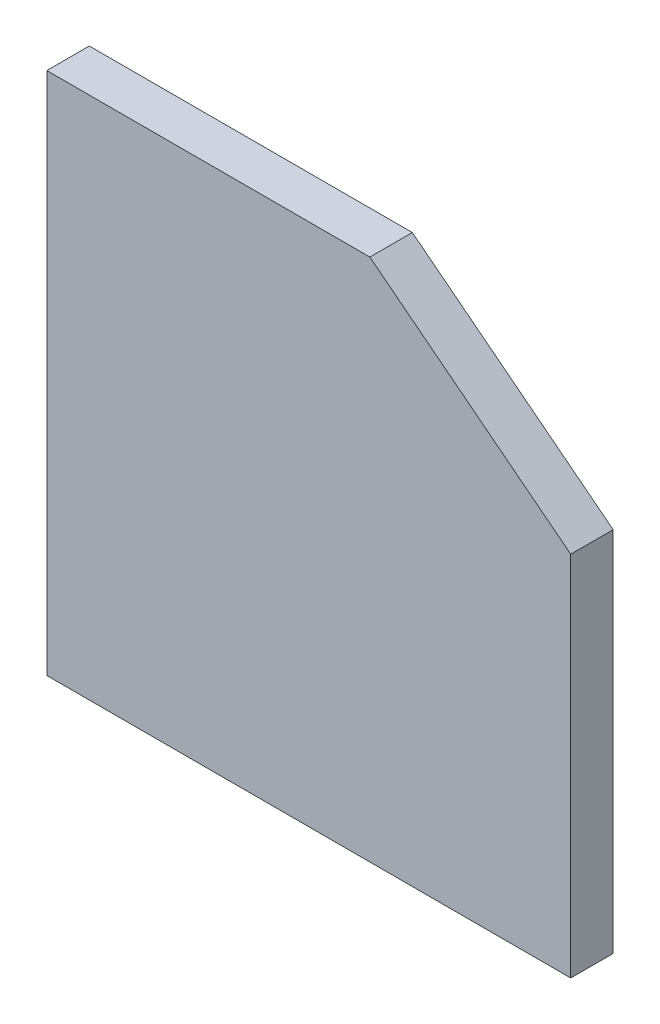
ISO-10303-21;
HEADER;
FILE_DESCRIPTION(('STEP AP214'),'2;1');
FILE_NAME('part.step','',(''),(''),'','','');
FILE_SCHEMA(('AUTOMOTIVE_DESIGN { 1 0 10303 214 1 1 1 1 }'));
ENDSEC;
DATA;
#1=APPLICATION_CONTEXT('core data for automotive mechanical design processes');
#2=APPLICATION_PROTOCOL_DEFINITION('international standard','automotive_design',2000,#1);
#3=PRODUCT_CONTEXT('',#1,'mechanical');
#4=PRODUCT('Part','Part','',(#3));
#5=PRODUCT_RELATED_PRODUCT_CATEGORY('part','',(#4));
#6=PRODUCT_DEFINITION_FORMATION('','',#4);
#7=PRODUCT_DEFINITION_CONTEXT('part definition',#1,'design');
#8=PRODUCT_DEFINITION('design','',#6,#7);
#9=PRODUCT_DEFINITION_SHAPE('','',#8);
#10=(LENGTH_UNIT() NAMED_UNIT(*) SI_UNIT(.MILLI.,.METRE.));
#11=(NAMED_UNIT(*) PLANE_ANGLE_UNIT() SI_UNIT($,.RADIAN.));
#12=(NAMED_UNIT(*) SI_UNIT($,.STERADIAN.) SOLID_ANGLE_UNIT());
#13=UNCERTAINTY_MEASURE_WITH_UNIT(LENGTH_MEASURE(1.E-05),#10,'distance_accuracy_value','');
#14=(GEOMETRIC_REPRESENTATION_CONTEXT(3) GLOBAL_UNCERTAINTY_ASSIGNED_CONTEXT((#13)) GLOBAL_UNIT_ASSIGNED_CONTEXT((#10,
#11,#12)) REPRESENTATION_CONTEXT('',''));
#15=CARTESIAN_POINT('',(0.,0.,0.));
#16=DIRECTION('',(0.,0.,1.));
#17=DIRECTION('',(1.,0.,0.));
#18=AXIS2_PLACEMENT_3D('',#15,#16,#17);
#19=CARTESIAN_POINT('',(0.,0.,3.));
#20=DIRECTION('',(0.,1.,0.));
#21=DIRECTION('',(0.,0.,1.));
#22=AXIS2_PLACEMENT_3D('',#19,#20,#21);
#23=PLANE('',#22);
#24=DIRECTION('',(1.,0.,0.));
#25=VECTOR('',#24,1.);
#26=CARTESIAN_POINT('',(0.,0.,0.));
#27=LINE('',#26,#25);
#28=CARTESIAN_POINT('',(0.,0.,0.));
#29=VERTEX_POINT('',#28);
#30=CARTESIAN_POINT('',(36.9999999999999,0.,0.));
#31=VERTEX_POINT('',#30);
#32=EDGE_CURVE('E113',#29,#31,#27,.T.);
#33=ORIENTED_EDGE('',*,*,#32,.T.);
#34=DIRECTION('',(0.,0.,-1.));
#35=VECTOR('',#34,1.);
#36=CARTESIAN_POINT('',(36.9999999999999,0.,3.));
#37=LINE('',#36,#35);
#38=CARTESIAN_POINT('',(36.9999999999999,0.,3.));
#39=VERTEX_POINT('',#38);
#40=EDGE_CURVE('E11',#39,#31,#37,.T.);
#41=ORIENTED_EDGE('',*,*,#40,.F.);
#42=DIRECTION('',(1.,0.,0.));
#43=VECTOR('',#42,1.);
#44=CARTESIAN_POINT('',(0.,0.,3.));
#45=LINE('',#44,#43);
#46=CARTESIAN_POINT('',(0.,0.,3.));
#47=VERTEX_POINT('',#46);
#48=EDGE_CURVE('E124',#47,#39,#45,.T.);
#49=ORIENTED_EDGE('',*,*,#48,.F.);
#50=DIRECTION('',(0.,0.,-1.));
#51=VECTOR('',#50,1.);
#52=CARTESIAN_POINT('',(0.,0.,3.));
#53=LINE('',#52,#51);
#54=EDGE_CURVE('E55',#47,#29,#53,.T.);
#55=ORIENTED_EDGE('',*,*,#54,.T.);
#56=EDGE_LOOP('',(#33,#41,#49,#55));
#57=FACE_BOUND('',#56,.T.);
#58=ADVANCED_FACE('F39',(#57),#23,.F.);
#59=CARTESIAN_POINT('',(36.9999999999999,0.,3.));
#60=DIRECTION('',(-1.,0.,0.));
#61=DIRECTION('',(0.,0.,1.));
#62=AXIS2_PLACEMENT_3D('',#59,#60,#61);
#63=PLANE('',#62);
#64=DIRECTION('',(0.,1.,0.));
#65=VECTOR('',#64,1.);
#66=CARTESIAN_POINT('',(36.9999999999999,0.,0.));
#67=LINE('',#66,#65);
#68=CARTESIAN_POINT('',(36.9999999999999,25.9180934441379,0.));
#69=VERTEX_POINT('',#68);
#70=EDGE_CURVE('E115',#31,#69,#67,.T.);
#71=ORIENTED_EDGE('',*,*,#70,.T.);
#72=DIRECTION('',(0.,0.,-1.));
#73=VECTOR('',#72,1.);
#74=CARTESIAN_POINT('',(36.9999999999999,25.9180934441379,3.));
#75=LINE('',#74,#73);
#76=CARTESIAN_POINT('',(36.9999999999999,25.9180934441379,3.));
#77=VERTEX_POINT('',#76);
#78=EDGE_CURVE('E47',#77,#69,#75,.T.);
#79=ORIENTED_EDGE('',*,*,#78,.F.);
#80=DIRECTION('',(0.,1.,0.));
#81=VECTOR('',#80,1.);
#82=CARTESIAN_POINT('',(36.9999999999999,0.,3.));
#83=LINE('',#82,#81);
#84=EDGE_CURVE('E84',#39,#77,#83,.T.);
#85=ORIENTED_EDGE('',*,*,#84,.F.);
#86=ORIENTED_EDGE('',*,*,#40,.T.);
#87=EDGE_LOOP('',(#71,#79,#85,#86));
#88=FACE_BOUND('',#87,.T.);
#89=ADVANCED_FACE('F126',(#88),#63,.F.);
#90=CARTESIAN_POINT('',(26.5985525824408,34.0445948063424,3.));
#91=DIRECTION('',(0.615661475325661,0.788010753606719,0.));
#92=DIRECTION('',(-0.78801075360672,0.615661475325662,0.));
#93=AXIS2_PLACEMENT_3D('',#90,#91,#92);
#94=PLANE('',#93);
#95=DIRECTION('',(0.78801075360672,-0.615661475325662,0.));
#96=VECTOR('',#95,1.);
#97=CARTESIAN_POINT('',(26.5985525824408,34.0445948063424,0.));
#98=LINE('',#97,#96);
#99=CARTESIAN_POINT('',(22.8158064350787,37.,0.));
#100=VERTEX_POINT('',#99);
#101=EDGE_CURVE('E96',#100,#69,#98,.T.);
#102=ORIENTED_EDGE('',*,*,#101,.F.);
#103=DIRECTION('',(0.,0.,-1.));
#104=VECTOR('',#103,1.);
#105=CARTESIAN_POINT('',(22.8158064350787,37.,3.));
#106=LINE('',#105,#104);
#107=CARTESIAN_POINT('',(22.8158064350787,37.,3.));
#108=VERTEX_POINT('',#107);
#109=EDGE_CURVE('E91',#108,#100,#106,.T.);
#110=ORIENTED_EDGE('',*,*,#109,.F.);
#111=DIRECTION('',(0.78801075360672,-0.615661475325662,0.));
#112=VECTOR('',#111,1.);
#113=CARTESIAN_POINT('',(26.5985525824408,34.0445948063424,3.));
#114=LINE('',#113,#112);
#115=EDGE_CURVE('E94',#108,#77,#114,.T.);
#116=ORIENTED_EDGE('',*,*,#115,.T.);
#117=ORIENTED_EDGE('',*,*,#78,.T.);
#118=EDGE_LOOP('',(#102,#110,#116,#117));
#119=FACE_BOUND('',#118,.T.);
#120=ADVANCED_FACE('F93',(#119),#94,.T.);
#121=CARTESIAN_POINT('',(0.,37.,3.));
#122=DIRECTION('',(0.,1.,0.));
#123=DIRECTION('',(0.,0.,1.));
#124=AXIS2_PLACEMENT_3D('',#121,#122,#123);
#125=PLANE('',#124);
#126=DIRECTION('',(1.,0.,0.));
#127=VECTOR('',#126,1.);
#128=CARTESIAN_POINT('',(0.,37.,0.));
#129=LINE('',#128,#127);
#130=CARTESIAN_POINT('',(0.,37.,0.));
#131=VERTEX_POINT('',#130);
#132=EDGE_CURVE('E119',#131,#100,#129,.T.);
#133=ORIENTED_EDGE('',*,*,#132,.F.);
#134=DIRECTION('',(0.,0.,-1.));
#135=VECTOR('',#134,1.);
#136=CARTESIAN_POINT('',(0.,37.,3.));
#137=LINE('',#136,#135);
#138=CARTESIAN_POINT('',(0.,37.,3.));
#139=VERTEX_POINT('',#138);
#140=EDGE_CURVE('E72',#139,#131,#137,.T.);
#141=ORIENTED_EDGE('',*,*,#140,.F.);
#142=DIRECTION('',(1.,0.,0.));
#143=VECTOR('',#142,1.);
#144=CARTESIAN_POINT('',(0.,37.,3.));
#145=LINE('',#144,#143);
#146=EDGE_CURVE('E105',#139,#108,#145,.T.);
#147=ORIENTED_EDGE('',*,*,#146,.T.);
#148=ORIENTED_EDGE('',*,*,#109,.T.);
#149=EDGE_LOOP('',(#133,#141,#147,#148));
#150=FACE_BOUND('',#149,.T.);
#151=ADVANCED_FACE('F107',(#150),#125,.T.);
#152=CARTESIAN_POINT('',(0.,0.,3.));
#153=DIRECTION('',(-1.,0.,0.));
#154=DIRECTION('',(0.,0.,1.));
#155=AXIS2_PLACEMENT_3D('',#152,#153,#154);
#156=PLANE('',#155);
#157=DIRECTION('',(0.,1.,0.));
#158=VECTOR('',#157,1.);
#159=CARTESIAN_POINT('',(0.,0.,0.));
#160=LINE('',#159,#158);
#161=EDGE_CURVE('E121',#29,#131,#160,.T.);
#162=ORIENTED_EDGE('',*,*,#161,.F.);
#163=ORIENTED_EDGE('',*,*,#54,.F.);
#164=DIRECTION('',(0.,1.,0.));
#165=VECTOR('',#164,1.);
#166=CARTESIAN_POINT('',(0.,0.,3.));
#167=LINE('',#166,#165);
#168=EDGE_CURVE('E108',#47,#139,#167,.T.);
#169=ORIENTED_EDGE('',*,*,#168,.T.);
#170=ORIENTED_EDGE('',*,*,#140,.T.);
#171=EDGE_LOOP('',(#162,#163,#169,#170));
#172=FACE_BOUND('',#171,.T.);
#173=ADVANCED_FACE('F130',(#172),#156,.T.);
#174=CARTESIAN_POINT('',(0.,0.,3.));
#175=DIRECTION('',(0.,0.,1.));
#176=DIRECTION('',(1.,0.,0.));
#177=AXIS2_PLACEMENT_3D('',#174,#175,#176);
#178=PLANE('',#177);
#179=ORIENTED_EDGE('',*,*,#48,.T.);
#180=ORIENTED_EDGE('',*,*,#84,.T.);
#181=ORIENTED_EDGE('',*,*,#115,.F.);
#182=ORIENTED_EDGE('',*,*,#146,.F.);
#183=ORIENTED_EDGE('',*,*,#168,.F.);
#184=EDGE_LOOP('',(#179,#180,#181,#182,#183));
#185=FACE_BOUND('',#184,.T.);
#186=ADVANCED_FACE('F103',(#185),#178,.T.);
#187=CARTESIAN_POINT('',(0.,0.,0.));
#188=DIRECTION('',(0.,0.,1.));
#189=DIRECTION('',(1.,0.,0.));
#190=AXIS2_PLACEMENT_3D('',#187,#188,#189);
#191=PLANE('',#190);
#192=ORIENTED_EDGE('',*,*,#32,.F.);
#193=ORIENTED_EDGE('',*,*,#161,.T.);
#194=ORIENTED_EDGE('',*,*,#132,.T.);
#195=ORIENTED_EDGE('',*,*,#101,.T.);
#196=ORIENTED_EDGE('',*,*,#70,.F.);
#197=EDGE_LOOP('',(#192,#193,#194,#195,#196));
#198=FACE_BOUND('',#197,.T.);
#199=ADVANCED_FACE('F129',(#198),#191,.F.);
#200=CLOSED_SHELL('',(#58,#89,#120,#151,#173,#186,#199));
#201=MANIFOLD_SOLID_BREP('B2',#200);
#202=ADVANCED_BREP_SHAPE_REPRESENTATION('',(#18,#201),#14);
#203=SHAPE_DEFINITION_REPRESENTATION(#9,#202);
ENDSEC;
END-ISO-10303-21;
